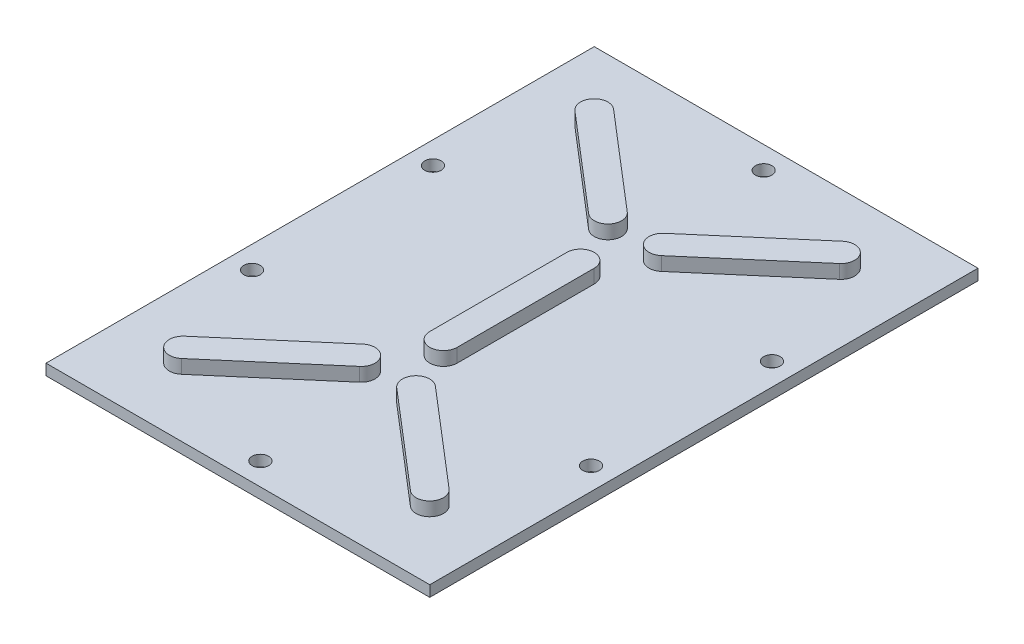
ISO-10303-21;
HEADER;
FILE_DESCRIPTION(('STEP AP214'),'2;1');
FILE_NAME('part.step','',(''),(''),'','','');
FILE_SCHEMA(('AUTOMOTIVE_DESIGN { 1 0 10303 214 1 1 1 1 }'));
ENDSEC;
DATA;
#1=APPLICATION_CONTEXT('core data for automotive mechanical design processes');
#2=APPLICATION_PROTOCOL_DEFINITION('international standard','automotive_design',2000,#1);
#3=PRODUCT_CONTEXT('',#1,'mechanical');
#4=PRODUCT('Part','Part','',(#3));
#5=PRODUCT_RELATED_PRODUCT_CATEGORY('part','',(#4));
#6=PRODUCT_DEFINITION_FORMATION('','',#4);
#7=PRODUCT_DEFINITION_CONTEXT('part definition',#1,'design');
#8=PRODUCT_DEFINITION('design','',#6,#7);
#9=PRODUCT_DEFINITION_SHAPE('','',#8);
#10=(LENGTH_UNIT() NAMED_UNIT(*) SI_UNIT(.MILLI.,.METRE.));
#11=(NAMED_UNIT(*) PLANE_ANGLE_UNIT() SI_UNIT($,.RADIAN.));
#12=(NAMED_UNIT(*) SI_UNIT($,.STERADIAN.) SOLID_ANGLE_UNIT());
#13=UNCERTAINTY_MEASURE_WITH_UNIT(LENGTH_MEASURE(1.E-05),#10,'distance_accuracy_value','');
#14=(GEOMETRIC_REPRESENTATION_CONTEXT(3) GLOBAL_UNCERTAINTY_ASSIGNED_CONTEXT((#13)) GLOBAL_UNIT_ASSIGNED_CONTEXT((#10,
#11,#12)) REPRESENTATION_CONTEXT('',''));
#15=CARTESIAN_POINT('',(0.,0.,0.));
#16=DIRECTION('',(0.,0.,1.));
#17=DIRECTION('',(1.,0.,0.));
#18=AXIS2_PLACEMENT_3D('',#15,#16,#17);
#19=CARTESIAN_POINT('',(0.,0.,0.));
#20=DIRECTION('',(0.,-1.,0.));
#21=DIRECTION('',(0.,0.,-1.));
#22=AXIS2_PLACEMENT_3D('',#19,#20,#21);
#23=PLANE('',#22);
#24=CARTESIAN_POINT('',(70.,0.,-191.8));
#25=DIRECTION('',(0.,1.,0.));
#26=DIRECTION('',(0.,0.,1.));
#27=AXIS2_PLACEMENT_3D('',#24,#25,#26);
#28=CIRCLE('',#27,3.00000000000001);
#29=CARTESIAN_POINT('',(70.,0.,-188.8));
#30=VERTEX_POINT('',#29);
#31=EDGE_CURVE('E389',#30,#30,#28,.T.);
#32=ORIENTED_EDGE('',*,*,#31,.F.);
#33=EDGE_LOOP('',(#32));
#34=FACE_BOUND('',#33,.T.);
#35=CARTESIAN_POINT('',(131.833925446024,0.,-133.));
#36=DIRECTION('',(0.,1.,0.));
#37=DIRECTION('',(0.,0.,-1.));
#38=AXIS2_PLACEMENT_3D('',#35,#36,#37);
#39=CIRCLE('',#38,3.00000000000002);
#40=CARTESIAN_POINT('',(131.833925446024,0.,-136.));
#41=VERTEX_POINT('',#40);
#42=EDGE_CURVE('E430',#41,#41,#39,.T.);
#43=ORIENTED_EDGE('',*,*,#42,.F.);
#44=EDGE_LOOP('',(#43));
#45=FACE_BOUND('',#44,.T.);
#46=CARTESIAN_POINT('',(8.16607455397644,0.,-133.));
#47=DIRECTION('',(0.,1.,0.));
#48=DIRECTION('',(0.,0.,1.));
#49=AXIS2_PLACEMENT_3D('',#46,#47,#48);
#50=CIRCLE('',#49,3.);
#51=CARTESIAN_POINT('',(8.16607455397644,0.,-130.));
#52=VERTEX_POINT('',#51);
#53=EDGE_CURVE('E423',#52,#52,#50,.T.);
#54=ORIENTED_EDGE('',*,*,#53,.F.);
#55=EDGE_LOOP('',(#54));
#56=FACE_BOUND('',#55,.T.);
#57=CARTESIAN_POINT('',(70.,0.,-8.19999999999999));
#58=DIRECTION('',(0.,1.,0.));
#59=DIRECTION('',(0.,0.,-1.));
#60=AXIS2_PLACEMENT_3D('',#57,#58,#59);
#61=CIRCLE('',#60,3.00000000000001);
#62=CARTESIAN_POINT('',(70.,0.,-11.2));
#63=VERTEX_POINT('',#62);
#64=EDGE_CURVE('E420',#63,#63,#61,.T.);
#65=ORIENTED_EDGE('',*,*,#64,.F.);
#66=EDGE_LOOP('',(#65));
#67=FACE_BOUND('',#66,.T.);
#68=CARTESIAN_POINT('',(8.16607455397644,0.,-67.));
#69=DIRECTION('',(0.,1.,0.));
#70=DIRECTION('',(0.,0.,-1.));
#71=AXIS2_PLACEMENT_3D('',#68,#69,#70);
#72=CIRCLE('',#71,3.);
#73=CARTESIAN_POINT('',(8.16607455397644,0.,-70.));
#74=VERTEX_POINT('',#73);
#75=EDGE_CURVE('E424',#74,#74,#72,.T.);
#76=ORIENTED_EDGE('',*,*,#75,.F.);
#77=EDGE_LOOP('',(#76));
#78=FACE_BOUND('',#77,.T.);
#79=CARTESIAN_POINT('',(131.833925446024,0.,-67.));
#80=DIRECTION('',(0.,1.,0.));
#81=DIRECTION('',(0.,0.,1.));
#82=AXIS2_PLACEMENT_3D('',#79,#80,#81);
#83=CIRCLE('',#82,2.99999999999999);
#84=CARTESIAN_POINT('',(131.833925446024,0.,-64.));
#85=VERTEX_POINT('',#84);
#86=EDGE_CURVE('E427',#85,#85,#83,.T.);
#87=ORIENTED_EDGE('',*,*,#86,.F.);
#88=EDGE_LOOP('',(#87));
#89=FACE_BOUND('',#88,.T.);
#90=CARTESIAN_POINT('',(60.,0.,-145.));
#91=DIRECTION('',(0.,1.,0.));
#92=DIRECTION('',(0.,0.,1.));
#93=AXIS2_PLACEMENT_3D('',#90,#91,#92);
#94=CIRCLE('',#93,5.00000000000001);
#95=CARTESIAN_POINT('',(56.7460431327202,0.,-141.203716988174));
#96=VERTEX_POINT('',#95);
#97=CARTESIAN_POINT('',(63.2539568672798,0.,-148.796283011826));
#98=VERTEX_POINT('',#97);
#99=EDGE_CURVE('E219',#96,#98,#94,.T.);
#100=ORIENTED_EDGE('',*,*,#99,.F.);
#101=DIRECTION('',(0.759256602365297,0.,0.650791373455968));
#102=VECTOR('',#101,1.);
#103=CARTESIAN_POINT('',(56.7460431327202,0.,-141.203716988174));
#104=LINE('',#103,#102);
#105=CARTESIAN_POINT('',(21.7460431327201,0.,-171.203716988174));
#106=VERTEX_POINT('',#105);
#107=EDGE_CURVE('E232',#106,#96,#104,.T.);
#108=ORIENTED_EDGE('',*,*,#107,.F.);
#109=CARTESIAN_POINT('',(25.,0.,-175.));
#110=DIRECTION('',(0.,1.,0.));
#111=DIRECTION('',(0.,0.,1.));
#112=AXIS2_PLACEMENT_3D('',#109,#110,#111);
#113=CIRCLE('',#112,5.00000000000002);
#114=CARTESIAN_POINT('',(28.2539568672799,0.,-178.796283011827));
#115=VERTEX_POINT('',#114);
#116=EDGE_CURVE('E241',#115,#106,#113,.T.);
#117=ORIENTED_EDGE('',*,*,#116,.F.);
#118=DIRECTION('',(-0.759256602365296,0.,-0.650791373455969));
#119=VECTOR('',#118,1.);
#120=CARTESIAN_POINT('',(63.2539568672798,0.,-148.796283011827));
#121=LINE('',#120,#119);
#122=EDGE_CURVE('E222',#98,#115,#121,.T.);
#123=ORIENTED_EDGE('',*,*,#122,.F.);
#124=EDGE_LOOP('',(#100,#108,#117,#123));
#125=FACE_BOUND('',#124,.T.);
#126=CARTESIAN_POINT('',(70.,0.,-75.));
#127=DIRECTION('',(0.,1.,0.));
#128=DIRECTION('',(0.,0.,1.));
#129=AXIS2_PLACEMENT_3D('',#126,#127,#128);
#130=CIRCLE('',#129,5.00000000000003);
#131=CARTESIAN_POINT('',(65.,0.,-75.));
#132=VERTEX_POINT('',#131);
#133=CARTESIAN_POINT('',(75.,0.,-75.));
#134=VERTEX_POINT('',#133);
#135=EDGE_CURVE('E290',#132,#134,#130,.T.);
#136=ORIENTED_EDGE('',*,*,#135,.F.);
#137=DIRECTION('',(0.,0.,1.));
#138=VECTOR('',#137,1.);
#139=CARTESIAN_POINT('',(65.,0.,-75.));
#140=LINE('',#139,#138);
#141=CARTESIAN_POINT('',(65.,0.,-125.));
#142=VERTEX_POINT('',#141);
#143=EDGE_CURVE('E295',#142,#132,#140,.T.);
#144=ORIENTED_EDGE('',*,*,#143,.F.);
#145=CARTESIAN_POINT('',(70.,0.,-125.));
#146=DIRECTION('',(0.,1.,0.));
#147=DIRECTION('',(0.,0.,1.));
#148=AXIS2_PLACEMENT_3D('',#145,#146,#147);
#149=CIRCLE('',#148,5.00000000000003);
#150=CARTESIAN_POINT('',(75.,0.,-125.));
#151=VERTEX_POINT('',#150);
#152=EDGE_CURVE('E307',#151,#142,#149,.T.);
#153=ORIENTED_EDGE('',*,*,#152,.F.);
#154=DIRECTION('',(0.,0.,-1.));
#155=VECTOR('',#154,1.);
#156=CARTESIAN_POINT('',(75.,0.,-75.));
#157=LINE('',#156,#155);
#158=EDGE_CURVE('E304',#134,#151,#157,.T.);
#159=ORIENTED_EDGE('',*,*,#158,.F.);
#160=EDGE_LOOP('',(#136,#144,#153,#159));
#161=FACE_BOUND('',#160,.T.);
#162=DIRECTION('',(0.,0.,1.));
#163=VECTOR('',#162,1.);
#164=CARTESIAN_POINT('',(0.,0.,0.));
#165=LINE('',#164,#163);
#166=CARTESIAN_POINT('',(0.,0.,-200.));
#167=VERTEX_POINT('',#166);
#168=CARTESIAN_POINT('',(0.,0.,0.));
#169=VERTEX_POINT('',#168);
#170=EDGE_CURVE('E356',#167,#169,#165,.T.);
#171=ORIENTED_EDGE('',*,*,#170,.T.);
#172=DIRECTION('',(1.,0.,0.));
#173=VECTOR('',#172,1.);
#174=CARTESIAN_POINT('',(0.,0.,0.));
#175=LINE('',#174,#173);
#176=CARTESIAN_POINT('',(140.,0.,0.));
#177=VERTEX_POINT('',#176);
#178=EDGE_CURVE('E373',#169,#177,#175,.T.);
#179=ORIENTED_EDGE('',*,*,#178,.T.);
#180=DIRECTION('',(0.,0.,-1.));
#181=VECTOR('',#180,1.);
#182=CARTESIAN_POINT('',(140.,0.,0.));
#183=LINE('',#182,#181);
#184=CARTESIAN_POINT('',(140.,0.,-200.));
#185=VERTEX_POINT('',#184);
#186=EDGE_CURVE('E376',#177,#185,#183,.T.);
#187=ORIENTED_EDGE('',*,*,#186,.T.);
#188=DIRECTION('',(-1.,0.,0.));
#189=VECTOR('',#188,1.);
#190=CARTESIAN_POINT('',(0.,0.,-200.));
#191=LINE('',#190,#189);
#192=EDGE_CURVE('E361',#185,#167,#191,.T.);
#193=ORIENTED_EDGE('',*,*,#192,.T.);
#194=EDGE_LOOP('',(#171,#179,#187,#193));
#195=FACE_BOUND('',#194,.T.);
#196=CARTESIAN_POINT('',(80.,0.,-55.));
#197=DIRECTION('',(0.,1.,0.));
#198=DIRECTION('',(0.,0.,1.));
#199=AXIS2_PLACEMENT_3D('',#196,#197,#198);
#200=CIRCLE('',#199,5.);
#201=CARTESIAN_POINT('',(83.2539568672799,0.,-58.7962830118265));
#202=VERTEX_POINT('',#201);
#203=CARTESIAN_POINT('',(76.7460431327202,0.,-51.2037169881735));
#204=VERTEX_POINT('',#203);
#205=EDGE_CURVE('E323',#202,#204,#200,.T.);
#206=ORIENTED_EDGE('',*,*,#205,.F.);
#207=DIRECTION('',(-0.759256602365297,0.,-0.650791373455968));
#208=VECTOR('',#207,1.);
#209=CARTESIAN_POINT('',(83.2539568672799,0.,-58.7962830118265));
#210=LINE('',#209,#208);
#211=CARTESIAN_POINT('',(118.25395686728,0.,-28.7962830118265));
#212=VERTEX_POINT('',#211);
#213=EDGE_CURVE('E328',#212,#202,#210,.T.);
#214=ORIENTED_EDGE('',*,*,#213,.F.);
#215=CARTESIAN_POINT('',(115.,0.,-25.));
#216=DIRECTION('',(0.,1.,0.));
#217=DIRECTION('',(0.,0.,1.));
#218=AXIS2_PLACEMENT_3D('',#215,#216,#217);
#219=CIRCLE('',#218,5.00000000000002);
#220=CARTESIAN_POINT('',(111.74604313272,0.,-21.2037169881735));
#221=VERTEX_POINT('',#220);
#222=EDGE_CURVE('E340',#221,#212,#219,.T.);
#223=ORIENTED_EDGE('',*,*,#222,.F.);
#224=DIRECTION('',(0.759256602365296,0.,0.650791373455969));
#225=VECTOR('',#224,1.);
#226=CARTESIAN_POINT('',(76.7460431327202,0.,-51.2037169881735));
#227=LINE('',#226,#225);
#228=EDGE_CURVE('E337',#204,#221,#227,.T.);
#229=ORIENTED_EDGE('',*,*,#228,.F.);
#230=EDGE_LOOP('',(#206,#214,#223,#229));
#231=FACE_BOUND('',#230,.T.);
#232=CARTESIAN_POINT('',(60.,0.,-55.));
#233=DIRECTION('',(0.,1.,0.));
#234=DIRECTION('',(0.,0.,-1.));
#235=AXIS2_PLACEMENT_3D('',#232,#233,#234);
#236=CIRCLE('',#235,5.);
#237=CARTESIAN_POINT('',(63.2539568672798,0.,-51.2037169881735));
#238=VERTEX_POINT('',#237);
#239=CARTESIAN_POINT('',(56.7460431327202,0.,-58.7962830118265));
#240=VERTEX_POINT('',#239);
#241=EDGE_CURVE('E257',#238,#240,#236,.T.);
#242=ORIENTED_EDGE('',*,*,#241,.F.);
#243=DIRECTION('',(0.759256602365296,0.,-0.650791373455969));
#244=VECTOR('',#243,1.);
#245=CARTESIAN_POINT('',(63.2539568672798,0.,-51.2037169881735));
#246=LINE('',#245,#244);
#247=CARTESIAN_POINT('',(28.2539568672799,0.,-21.2037169881735));
#248=VERTEX_POINT('',#247);
#249=EDGE_CURVE('E262',#248,#238,#246,.T.);
#250=ORIENTED_EDGE('',*,*,#249,.F.);
#251=CARTESIAN_POINT('',(25.,0.,-25.));
#252=DIRECTION('',(0.,1.,0.));
#253=DIRECTION('',(0.,0.,-1.));
#254=AXIS2_PLACEMENT_3D('',#251,#252,#253);
#255=CIRCLE('',#254,5.00000000000002);
#256=CARTESIAN_POINT('',(21.7460431327201,0.,-28.7962830118265));
#257=VERTEX_POINT('',#256);
#258=EDGE_CURVE('E274',#257,#248,#255,.T.);
#259=ORIENTED_EDGE('',*,*,#258,.F.);
#260=DIRECTION('',(-0.759256602365297,0.,0.650791373455968));
#261=VECTOR('',#260,1.);
#262=CARTESIAN_POINT('',(56.7460431327202,0.,-58.7962830118265));
#263=LINE('',#262,#261);
#264=EDGE_CURVE('E271',#240,#257,#263,.T.);
#265=ORIENTED_EDGE('',*,*,#264,.F.);
#266=EDGE_LOOP('',(#242,#250,#259,#265));
#267=FACE_BOUND('',#266,.T.);
#268=CARTESIAN_POINT('',(80.,0.,-145.));
#269=DIRECTION('',(0.,1.,0.));
#270=DIRECTION('',(0.,0.,-1.));
#271=AXIS2_PLACEMENT_3D('',#268,#269,#270);
#272=CIRCLE('',#271,5.00000000000001);
#273=CARTESIAN_POINT('',(76.7460431327202,0.,-148.796283011827));
#274=VERTEX_POINT('',#273);
#275=CARTESIAN_POINT('',(83.2539568672799,0.,-141.203716988174));
#276=VERTEX_POINT('',#275);
#277=EDGE_CURVE('E218',#274,#276,#272,.T.);
#278=ORIENTED_EDGE('',*,*,#277,.F.);
#279=DIRECTION('',(-0.759256602365296,0.,0.650791373455969));
#280=VECTOR('',#279,1.);
#281=CARTESIAN_POINT('',(76.7460431327202,0.,-148.796283011827));
#282=LINE('',#281,#280);
#283=CARTESIAN_POINT('',(111.74604313272,0.,-178.796283011827));
#284=VERTEX_POINT('',#283);
#285=EDGE_CURVE('E215',#284,#274,#282,.T.);
#286=ORIENTED_EDGE('',*,*,#285,.F.);
#287=CARTESIAN_POINT('',(115.,0.,-175.));
#288=DIRECTION('',(0.,1.,0.));
#289=DIRECTION('',(0.,0.,-1.));
#290=AXIS2_PLACEMENT_3D('',#287,#288,#289);
#291=CIRCLE('',#290,5.00000000000002);
#292=CARTESIAN_POINT('',(118.25395686728,0.,-171.203716988174));
#293=VERTEX_POINT('',#292);
#294=EDGE_CURVE('E58',#293,#284,#291,.T.);
#295=ORIENTED_EDGE('',*,*,#294,.F.);
#296=DIRECTION('',(0.759256602365297,0.,-0.650791373455968));
#297=VECTOR('',#296,1.);
#298=CARTESIAN_POINT('',(83.2539568672799,0.,-141.203716988174));
#299=LINE('',#298,#297);
#300=EDGE_CURVE('E53',#276,#293,#299,.T.);
#301=ORIENTED_EDGE('',*,*,#300,.F.);
#302=EDGE_LOOP('',(#278,#286,#295,#301));
#303=FACE_BOUND('',#302,.T.);
#304=ADVANCED_FACE('F36',(#34,#45,#56,#67,#78,#89,#125,#161,#195,#231,#267,#303),#23,.F.);
#305=CARTESIAN_POINT('',(0.,-4.,0.));
#306=DIRECTION('',(-1.,0.,0.));
#307=DIRECTION('',(0.,0.,1.));
#308=AXIS2_PLACEMENT_3D('',#305,#306,#307);
#309=PLANE('',#308);
#310=ORIENTED_EDGE('',*,*,#170,.F.);
#311=DIRECTION('',(0.,1.,0.));
#312=VECTOR('',#311,1.);
#313=CARTESIAN_POINT('',(0.,-4.,-200.));
#314=LINE('',#313,#312);
#315=CARTESIAN_POINT('',(0.,-4.,-200.));
#316=VERTEX_POINT('',#315);
#317=EDGE_CURVE('E11',#316,#167,#314,.T.);
#318=ORIENTED_EDGE('',*,*,#317,.F.);
#319=DIRECTION('',(0.,0.,1.));
#320=VECTOR('',#319,1.);
#321=CARTESIAN_POINT('',(0.,-4.,0.));
#322=LINE('',#321,#320);
#323=CARTESIAN_POINT('',(0.,-4.,0.));
#324=VERTEX_POINT('',#323);
#325=EDGE_CURVE('E357',#316,#324,#322,.T.);
#326=ORIENTED_EDGE('',*,*,#325,.T.);
#327=DIRECTION('',(0.,1.,0.));
#328=VECTOR('',#327,1.);
#329=CARTESIAN_POINT('',(0.,-4.,0.));
#330=LINE('',#329,#328);
#331=EDGE_CURVE('E370',#324,#169,#330,.T.);
#332=ORIENTED_EDGE('',*,*,#331,.T.);
#333=EDGE_LOOP('',(#310,#318,#326,#332));
#334=FACE_BOUND('',#333,.T.);
#335=ADVANCED_FACE('F38',(#334),#309,.T.);
#336=CARTESIAN_POINT('',(0.,-4.,-200.));
#337=DIRECTION('',(0.,0.,-1.));
#338=DIRECTION('',(-1.,0.,0.));
#339=AXIS2_PLACEMENT_3D('',#336,#337,#338);
#340=PLANE('',#339);
#341=ORIENTED_EDGE('',*,*,#192,.F.);
#342=DIRECTION('',(0.,1.,0.));
#343=VECTOR('',#342,1.);
#344=CARTESIAN_POINT('',(140.,-4.,-200.));
#345=LINE('',#344,#343);
#346=CARTESIAN_POINT('',(140.,-4.,-200.));
#347=VERTEX_POINT('',#346);
#348=EDGE_CURVE('E45',#347,#185,#345,.T.);
#349=ORIENTED_EDGE('',*,*,#348,.F.);
#350=DIRECTION('',(-1.,0.,0.));
#351=VECTOR('',#350,1.);
#352=CARTESIAN_POINT('',(0.,-4.,-200.));
#353=LINE('',#352,#351);
#354=EDGE_CURVE('E367',#347,#316,#353,.T.);
#355=ORIENTED_EDGE('',*,*,#354,.T.);
#356=ORIENTED_EDGE('',*,*,#317,.T.);
#357=EDGE_LOOP('',(#341,#349,#355,#356));
#358=FACE_BOUND('',#357,.T.);
#359=ADVANCED_FACE('F530',(#358),#340,.T.);
#360=CARTESIAN_POINT('',(140.,-4.,0.));
#361=DIRECTION('',(1.,0.,0.));
#362=DIRECTION('',(0.,0.,-1.));
#363=AXIS2_PLACEMENT_3D('',#360,#361,#362);
#364=PLANE('',#363);
#365=ORIENTED_EDGE('',*,*,#186,.F.);
#366=DIRECTION('',(0.,1.,0.));
#367=VECTOR('',#366,1.);
#368=CARTESIAN_POINT('',(140.,-4.,0.));
#369=LINE('',#368,#367);
#370=CARTESIAN_POINT('',(140.,-4.,0.));
#371=VERTEX_POINT('',#370);
#372=EDGE_CURVE('E382',#371,#177,#369,.T.);
#373=ORIENTED_EDGE('',*,*,#372,.F.);
#374=DIRECTION('',(0.,0.,-1.));
#375=VECTOR('',#374,1.);
#376=CARTESIAN_POINT('',(140.,-4.,0.));
#377=LINE('',#376,#375);
#378=EDGE_CURVE('E364',#371,#347,#377,.T.);
#379=ORIENTED_EDGE('',*,*,#378,.T.);
#380=ORIENTED_EDGE('',*,*,#348,.T.);
#381=EDGE_LOOP('',(#365,#373,#379,#380));
#382=FACE_BOUND('',#381,.T.);
#383=ADVANCED_FACE('F533',(#382),#364,.T.);
#384=CARTESIAN_POINT('',(0.,-4.,0.));
#385=DIRECTION('',(0.,0.,1.));
#386=DIRECTION('',(1.,0.,0.));
#387=AXIS2_PLACEMENT_3D('',#384,#385,#386);
#388=PLANE('',#387);
#389=ORIENTED_EDGE('',*,*,#178,.F.);
#390=ORIENTED_EDGE('',*,*,#331,.F.);
#391=DIRECTION('',(1.,0.,0.));
#392=VECTOR('',#391,1.);
#393=CARTESIAN_POINT('',(0.,-4.,0.));
#394=LINE('',#393,#392);
#395=EDGE_CURVE('E360',#324,#371,#394,.T.);
#396=ORIENTED_EDGE('',*,*,#395,.T.);
#397=ORIENTED_EDGE('',*,*,#372,.T.);
#398=EDGE_LOOP('',(#389,#390,#396,#397));
#399=FACE_BOUND('',#398,.T.);
#400=ADVANCED_FACE('F527',(#399),#388,.T.);
#401=CARTESIAN_POINT('',(0.,-4.,0.));
#402=DIRECTION('',(0.,-1.,0.));
#403=DIRECTION('',(0.,0.,-1.));
#404=AXIS2_PLACEMENT_3D('',#401,#402,#403);
#405=PLANE('',#404);
#406=CARTESIAN_POINT('',(70.,-4.,-191.8));
#407=DIRECTION('',(0.,-1.,0.));
#408=DIRECTION('',(0.,0.,-1.));
#409=AXIS2_PLACEMENT_3D('',#406,#407,#408);
#410=CIRCLE('',#409,3.00000000000001);
#411=CARTESIAN_POINT('',(70.,-4.,-194.8));
#412=VERTEX_POINT('',#411);
#413=EDGE_CURVE('E40',#412,#412,#410,.T.);
#414=ORIENTED_EDGE('',*,*,#413,.F.);
#415=EDGE_LOOP('',(#414));
#416=FACE_BOUND('',#415,.T.);
#417=CARTESIAN_POINT('',(131.833925446024,-4.,-133.));
#418=DIRECTION('',(0.,-1.,0.));
#419=DIRECTION('',(0.,0.,-1.));
#420=AXIS2_PLACEMENT_3D('',#417,#418,#419);
#421=CIRCLE('',#420,3.00000000000002);
#422=CARTESIAN_POINT('',(131.833925446024,-4.,-136.));
#423=VERTEX_POINT('',#422);
#424=EDGE_CURVE('E397',#423,#423,#421,.T.);
#425=ORIENTED_EDGE('',*,*,#424,.F.);
#426=EDGE_LOOP('',(#425));
#427=FACE_BOUND('',#426,.T.);
#428=CARTESIAN_POINT('',(8.16607455397644,-4.,-133.));
#429=DIRECTION('',(0.,-1.,0.));
#430=DIRECTION('',(0.,0.,-1.));
#431=AXIS2_PLACEMENT_3D('',#428,#429,#430);
#432=CIRCLE('',#431,3.);
#433=CARTESIAN_POINT('',(8.16607455397644,-4.,-136.));
#434=VERTEX_POINT('',#433);
#435=EDGE_CURVE('E395',#434,#434,#432,.T.);
#436=ORIENTED_EDGE('',*,*,#435,.F.);
#437=EDGE_LOOP('',(#436));
#438=FACE_BOUND('',#437,.T.);
#439=CARTESIAN_POINT('',(70.,-4.,-8.19999999999999));
#440=DIRECTION('',(0.,-1.,0.));
#441=DIRECTION('',(0.,0.,-1.));
#442=AXIS2_PLACEMENT_3D('',#439,#440,#441);
#443=CIRCLE('',#442,3.00000000000001);
#444=CARTESIAN_POINT('',(70.,-4.,-11.2));
#445=VERTEX_POINT('',#444);
#446=EDGE_CURVE('E392',#445,#445,#443,.T.);
#447=ORIENTED_EDGE('',*,*,#446,.F.);
#448=EDGE_LOOP('',(#447));
#449=FACE_BOUND('',#448,.T.);
#450=CARTESIAN_POINT('',(8.16607455397644,-4.,-67.));
#451=DIRECTION('',(0.,-1.,0.));
#452=DIRECTION('',(0.,0.,-1.));
#453=AXIS2_PLACEMENT_3D('',#450,#451,#452);
#454=CIRCLE('',#453,3.);
#455=CARTESIAN_POINT('',(8.16607455397644,-4.,-70.));
#456=VERTEX_POINT('',#455);
#457=EDGE_CURVE('E388',#456,#456,#454,.T.);
#458=ORIENTED_EDGE('',*,*,#457,.F.);
#459=EDGE_LOOP('',(#458));
#460=FACE_BOUND('',#459,.T.);
#461=CARTESIAN_POINT('',(131.833925446024,-4.,-67.));
#462=DIRECTION('',(0.,-1.,0.));
#463=DIRECTION('',(0.,0.,-1.));
#464=AXIS2_PLACEMENT_3D('',#461,#462,#463);
#465=CIRCLE('',#464,2.99999999999999);
#466=CARTESIAN_POINT('',(131.833925446024,-4.,-70.));
#467=VERTEX_POINT('',#466);
#468=EDGE_CURVE('E385',#467,#467,#465,.T.);
#469=ORIENTED_EDGE('',*,*,#468,.F.);
#470=EDGE_LOOP('',(#469));
#471=FACE_BOUND('',#470,.T.);
#472=ORIENTED_EDGE('',*,*,#325,.F.);
#473=ORIENTED_EDGE('',*,*,#354,.F.);
#474=ORIENTED_EDGE('',*,*,#378,.F.);
#475=ORIENTED_EDGE('',*,*,#395,.F.);
#476=EDGE_LOOP('',(#472,#473,#474,#475));
#477=FACE_BOUND('',#476,.T.);
#478=ADVANCED_FACE('F524',(#416,#427,#438,#449,#460,#471,#477),#405,.T.);
#479=CARTESIAN_POINT('',(80.,5.,-55.));
#480=DIRECTION('',(0.,-1.,0.));
#481=DIRECTION('',(0.,0.,-1.));
#482=AXIS2_PLACEMENT_3D('',#479,#480,#481);
#483=CYLINDRICAL_SURFACE('',#482,5.);
#484=ORIENTED_EDGE('',*,*,#205,.T.);
#485=DIRECTION('',(0.,-1.,0.));
#486=VECTOR('',#485,1.);
#487=CARTESIAN_POINT('',(76.7460431327202,5.,-51.2037169881735));
#488=LINE('',#487,#486);
#489=CARTESIAN_POINT('',(76.7460431327202,5.,-51.2037169881735));
#490=VERTEX_POINT('',#489);
#491=EDGE_CURVE('E353',#490,#204,#488,.T.);
#492=ORIENTED_EDGE('',*,*,#491,.F.);
#493=CARTESIAN_POINT('',(80.,5.,-55.));
#494=DIRECTION('',(0.,1.,0.));
#495=DIRECTION('',(0.,0.,1.));
#496=AXIS2_PLACEMENT_3D('',#493,#494,#495);
#497=CIRCLE('',#496,5.);
#498=CARTESIAN_POINT('',(83.2539568672799,5.,-58.7962830118265));
#499=VERTEX_POINT('',#498);
#500=EDGE_CURVE('E324',#499,#490,#497,.T.);
#501=ORIENTED_EDGE('',*,*,#500,.F.);
#502=DIRECTION('',(0.,-1.,0.));
#503=VECTOR('',#502,1.);
#504=CARTESIAN_POINT('',(83.2539568672799,5.,-58.7962830118265));
#505=LINE('',#504,#503);
#506=EDGE_CURVE('E334',#499,#202,#505,.T.);
#507=ORIENTED_EDGE('',*,*,#506,.T.);
#508=EDGE_LOOP('',(#484,#492,#501,#507));
#509=FACE_BOUND('',#508,.T.);
#510=ADVANCED_FACE('F520',(#509),#483,.T.);
#511=CARTESIAN_POINT('',(76.7460431327202,5.,-51.2037169881735));
#512=DIRECTION('',(0.650791373455969,0.,-0.759256602365296));
#513=DIRECTION('',(-0.759256602365296,0.,-0.650791373455969));
#514=AXIS2_PLACEMENT_3D('',#511,#512,#513);
#515=PLANE('',#514);
#516=ORIENTED_EDGE('',*,*,#228,.T.);
#517=DIRECTION('',(0.,-1.,0.));
#518=VECTOR('',#517,1.);
#519=CARTESIAN_POINT('',(111.74604313272,5.,-21.2037169881735));
#520=LINE('',#519,#518);
#521=CARTESIAN_POINT('',(111.74604313272,5.,-21.2037169881735));
#522=VERTEX_POINT('',#521);
#523=EDGE_CURVE('E350',#522,#221,#520,.T.);
#524=ORIENTED_EDGE('',*,*,#523,.F.);
#525=DIRECTION('',(0.759256602365296,0.,0.650791373455969));
#526=VECTOR('',#525,1.);
#527=CARTESIAN_POINT('',(76.7460431327202,5.,-51.2037169881735));
#528=LINE('',#527,#526);
#529=EDGE_CURVE('E327',#490,#522,#528,.T.);
#530=ORIENTED_EDGE('',*,*,#529,.F.);
#531=ORIENTED_EDGE('',*,*,#491,.T.);
#532=EDGE_LOOP('',(#516,#524,#530,#531));
#533=FACE_BOUND('',#532,.T.);
#534=ADVANCED_FACE('F516',(#533),#515,.F.);
#535=CARTESIAN_POINT('',(115.,5.,-25.));
#536=DIRECTION('',(0.,-1.,0.));
#537=DIRECTION('',(0.,0.,-1.));
#538=AXIS2_PLACEMENT_3D('',#535,#536,#537);
#539=CYLINDRICAL_SURFACE('',#538,5.00000000000002);
#540=ORIENTED_EDGE('',*,*,#222,.T.);
#541=DIRECTION('',(0.,-1.,0.));
#542=VECTOR('',#541,1.);
#543=CARTESIAN_POINT('',(118.25395686728,5.,-28.7962830118265));
#544=LINE('',#543,#542);
#545=CARTESIAN_POINT('',(118.25395686728,5.,-28.7962830118265));
#546=VERTEX_POINT('',#545);
#547=EDGE_CURVE('E347',#546,#212,#544,.T.);
#548=ORIENTED_EDGE('',*,*,#547,.F.);
#549=CARTESIAN_POINT('',(115.,5.,-25.));
#550=DIRECTION('',(0.,1.,0.));
#551=DIRECTION('',(0.,0.,1.));
#552=AXIS2_PLACEMENT_3D('',#549,#550,#551);
#553=CIRCLE('',#552,5.00000000000002);
#554=EDGE_CURVE('E330',#522,#546,#553,.T.);
#555=ORIENTED_EDGE('',*,*,#554,.F.);
#556=ORIENTED_EDGE('',*,*,#523,.T.);
#557=EDGE_LOOP('',(#540,#548,#555,#556));
#558=FACE_BOUND('',#557,.T.);
#559=ADVANCED_FACE('F512',(#558),#539,.T.);
#560=CARTESIAN_POINT('',(83.2539568672799,5.,-58.7962830118265));
#561=DIRECTION('',(-0.650791373455968,0.,0.759256602365297));
#562=DIRECTION('',(0.759256602365297,0.,0.650791373455968));
#563=AXIS2_PLACEMENT_3D('',#560,#561,#562);
#564=PLANE('',#563);
#565=ORIENTED_EDGE('',*,*,#213,.T.);
#566=ORIENTED_EDGE('',*,*,#506,.F.);
#567=DIRECTION('',(-0.759256602365297,0.,-0.650791373455968));
#568=VECTOR('',#567,1.);
#569=CARTESIAN_POINT('',(83.2539568672799,5.,-58.7962830118265));
#570=LINE('',#569,#568);
#571=EDGE_CURVE('E332',#546,#499,#570,.T.);
#572=ORIENTED_EDGE('',*,*,#571,.F.);
#573=ORIENTED_EDGE('',*,*,#547,.T.);
#574=EDGE_LOOP('',(#565,#566,#572,#573));
#575=FACE_BOUND('',#574,.T.);
#576=ADVANCED_FACE('F508',(#575),#564,.F.);
#577=CARTESIAN_POINT('',(80.,5.,-55.));
#578=DIRECTION('',(0.,1.,0.));
#579=DIRECTION('',(0.,0.,1.));
#580=AXIS2_PLACEMENT_3D('',#577,#578,#579);
#581=PLANE('',#580);
#582=ORIENTED_EDGE('',*,*,#500,.T.);
#583=ORIENTED_EDGE('',*,*,#529,.T.);
#584=ORIENTED_EDGE('',*,*,#554,.T.);
#585=ORIENTED_EDGE('',*,*,#571,.T.);
#586=EDGE_LOOP('',(#582,#583,#584,#585));
#587=FACE_BOUND('',#586,.T.);
#588=ADVANCED_FACE('F504',(#587),#581,.T.);
#589=CARTESIAN_POINT('',(70.,5.,-75.));
#590=DIRECTION('',(0.,-1.,0.));
#591=DIRECTION('',(0.,0.,-1.));
#592=AXIS2_PLACEMENT_3D('',#589,#590,#591);
#593=CYLINDRICAL_SURFACE('',#592,5.00000000000003);
#594=ORIENTED_EDGE('',*,*,#135,.T.);
#595=DIRECTION('',(0.,-1.,0.));
#596=VECTOR('',#595,1.);
#597=CARTESIAN_POINT('',(75.,5.,-75.));
#598=LINE('',#597,#596);
#599=CARTESIAN_POINT('',(75.,5.,-75.));
#600=VERTEX_POINT('',#599);
#601=EDGE_CURVE('E320',#600,#134,#598,.T.);
#602=ORIENTED_EDGE('',*,*,#601,.F.);
#603=CARTESIAN_POINT('',(70.,5.,-75.));
#604=DIRECTION('',(0.,1.,0.));
#605=DIRECTION('',(0.,0.,1.));
#606=AXIS2_PLACEMENT_3D('',#603,#604,#605);
#607=CIRCLE('',#606,5.00000000000003);
#608=CARTESIAN_POINT('',(65.,5.,-75.));
#609=VERTEX_POINT('',#608);
#610=EDGE_CURVE('E291',#609,#600,#607,.T.);
#611=ORIENTED_EDGE('',*,*,#610,.F.);
#612=DIRECTION('',(0.,-1.,0.));
#613=VECTOR('',#612,1.);
#614=CARTESIAN_POINT('',(65.,5.,-75.));
#615=LINE('',#614,#613);
#616=EDGE_CURVE('E301',#609,#132,#615,.T.);
#617=ORIENTED_EDGE('',*,*,#616,.T.);
#618=EDGE_LOOP('',(#594,#602,#611,#617));
#619=FACE_BOUND('',#618,.T.);
#620=ADVANCED_FACE('F500',(#619),#593,.T.);
#621=CARTESIAN_POINT('',(75.,5.,-75.));
#622=DIRECTION('',(-1.,0.,0.));
#623=DIRECTION('',(0.,0.,1.));
#624=AXIS2_PLACEMENT_3D('',#621,#622,#623);
#625=PLANE('',#624);
#626=ORIENTED_EDGE('',*,*,#158,.T.);
#627=DIRECTION('',(0.,-1.,0.));
#628=VECTOR('',#627,1.);
#629=CARTESIAN_POINT('',(75.,5.,-125.));
#630=LINE('',#629,#628);
#631=CARTESIAN_POINT('',(75.,5.,-125.));
#632=VERTEX_POINT('',#631);
#633=EDGE_CURVE('E317',#632,#151,#630,.T.);
#634=ORIENTED_EDGE('',*,*,#633,.F.);
#635=DIRECTION('',(0.,0.,-1.));
#636=VECTOR('',#635,1.);
#637=CARTESIAN_POINT('',(75.,5.,-75.));
#638=LINE('',#637,#636);
#639=EDGE_CURVE('E294',#600,#632,#638,.T.);
#640=ORIENTED_EDGE('',*,*,#639,.F.);
#641=ORIENTED_EDGE('',*,*,#601,.T.);
#642=EDGE_LOOP('',(#626,#634,#640,#641));
#643=FACE_BOUND('',#642,.T.);
#644=ADVANCED_FACE('F496',(#643),#625,.F.);
#645=CARTESIAN_POINT('',(70.,5.,-125.));
#646=DIRECTION('',(0.,-1.,0.));
#647=DIRECTION('',(0.,0.,-1.));
#648=AXIS2_PLACEMENT_3D('',#645,#646,#647);
#649=CYLINDRICAL_SURFACE('',#648,5.00000000000003);
#650=ORIENTED_EDGE('',*,*,#152,.T.);
#651=DIRECTION('',(0.,-1.,0.));
#652=VECTOR('',#651,1.);
#653=CARTESIAN_POINT('',(65.,5.,-125.));
#654=LINE('',#653,#652);
#655=CARTESIAN_POINT('',(65.,5.,-125.));
#656=VERTEX_POINT('',#655);
#657=EDGE_CURVE('E314',#656,#142,#654,.T.);
#658=ORIENTED_EDGE('',*,*,#657,.F.);
#659=CARTESIAN_POINT('',(70.,5.,-125.));
#660=DIRECTION('',(0.,1.,0.));
#661=DIRECTION('',(0.,0.,1.));
#662=AXIS2_PLACEMENT_3D('',#659,#660,#661);
#663=CIRCLE('',#662,5.00000000000003);
#664=EDGE_CURVE('E297',#632,#656,#663,.T.);
#665=ORIENTED_EDGE('',*,*,#664,.F.);
#666=ORIENTED_EDGE('',*,*,#633,.T.);
#667=EDGE_LOOP('',(#650,#658,#665,#666));
#668=FACE_BOUND('',#667,.T.);
#669=ADVANCED_FACE('F492',(#668),#649,.T.);
#670=CARTESIAN_POINT('',(65.,5.,-75.));
#671=DIRECTION('',(1.,0.,0.));
#672=DIRECTION('',(0.,0.,-1.));
#673=AXIS2_PLACEMENT_3D('',#670,#671,#672);
#674=PLANE('',#673);
#675=ORIENTED_EDGE('',*,*,#143,.T.);
#676=ORIENTED_EDGE('',*,*,#616,.F.);
#677=DIRECTION('',(0.,0.,1.));
#678=VECTOR('',#677,1.);
#679=CARTESIAN_POINT('',(65.,5.,-75.));
#680=LINE('',#679,#678);
#681=EDGE_CURVE('E299',#656,#609,#680,.T.);
#682=ORIENTED_EDGE('',*,*,#681,.F.);
#683=ORIENTED_EDGE('',*,*,#657,.T.);
#684=EDGE_LOOP('',(#675,#676,#682,#683));
#685=FACE_BOUND('',#684,.T.);
#686=ADVANCED_FACE('F488',(#685),#674,.F.);
#687=CARTESIAN_POINT('',(70.,5.,-75.));
#688=DIRECTION('',(0.,1.,0.));
#689=DIRECTION('',(0.,0.,1.));
#690=AXIS2_PLACEMENT_3D('',#687,#688,#689);
#691=PLANE('',#690);
#692=ORIENTED_EDGE('',*,*,#610,.T.);
#693=ORIENTED_EDGE('',*,*,#639,.T.);
#694=ORIENTED_EDGE('',*,*,#664,.T.);
#695=ORIENTED_EDGE('',*,*,#681,.T.);
#696=EDGE_LOOP('',(#692,#693,#694,#695));
#697=FACE_BOUND('',#696,.T.);
#698=ADVANCED_FACE('F482',(#697),#691,.T.);
#699=CARTESIAN_POINT('',(60.,5.,-55.));
#700=DIRECTION('',(0.,-1.,0.));
#701=DIRECTION('',(0.,0.,-1.));
#702=AXIS2_PLACEMENT_3D('',#699,#700,#701);
#703=CYLINDRICAL_SURFACE('',#702,5.);
#704=ORIENTED_EDGE('',*,*,#241,.T.);
#705=DIRECTION('',(0.,-1.,0.));
#706=VECTOR('',#705,1.);
#707=CARTESIAN_POINT('',(56.7460431327202,5.,-58.7962830118265));
#708=LINE('',#707,#706);
#709=CARTESIAN_POINT('',(56.7460431327202,5.,-58.7962830118265));
#710=VERTEX_POINT('',#709);
#711=EDGE_CURVE('E287',#710,#240,#708,.T.);
#712=ORIENTED_EDGE('',*,*,#711,.F.);
#713=CARTESIAN_POINT('',(60.,5.,-55.));
#714=DIRECTION('',(0.,1.,0.));
#715=DIRECTION('',(0.,0.,-1.));
#716=AXIS2_PLACEMENT_3D('',#713,#714,#715);
#717=CIRCLE('',#716,5.);
#718=CARTESIAN_POINT('',(63.2539568672798,5.,-51.2037169881735));
#719=VERTEX_POINT('',#718);
#720=EDGE_CURVE('E258',#719,#710,#717,.T.);
#721=ORIENTED_EDGE('',*,*,#720,.F.);
#722=DIRECTION('',(0.,-1.,0.));
#723=VECTOR('',#722,1.);
#724=CARTESIAN_POINT('',(63.2539568672798,5.,-51.2037169881735));
#725=LINE('',#724,#723);
#726=EDGE_CURVE('E268',#719,#238,#725,.T.);
#727=ORIENTED_EDGE('',*,*,#726,.T.);
#728=EDGE_LOOP('',(#704,#712,#721,#727));
#729=FACE_BOUND('',#728,.T.);
#730=ADVANCED_FACE('F466',(#729),#703,.T.);
#731=CARTESIAN_POINT('',(56.7460431327202,5.,-58.7962830118265));
#732=DIRECTION('',(0.650791373455968,0.,0.759256602365297));
#733=DIRECTION('',(0.759256602365297,0.,-0.650791373455968));
#734=AXIS2_PLACEMENT_3D('',#731,#732,#733);
#735=PLANE('',#734);
#736=ORIENTED_EDGE('',*,*,#264,.T.);
#737=DIRECTION('',(0.,-1.,0.));
#738=VECTOR('',#737,1.);
#739=CARTESIAN_POINT('',(21.7460431327201,5.,-28.7962830118265));
#740=LINE('',#739,#738);
#741=CARTESIAN_POINT('',(21.7460431327201,5.,-28.7962830118265));
#742=VERTEX_POINT('',#741);
#743=EDGE_CURVE('E284',#742,#257,#740,.T.);
#744=ORIENTED_EDGE('',*,*,#743,.F.);
#745=DIRECTION('',(-0.759256602365297,0.,0.650791373455968));
#746=VECTOR('',#745,1.);
#747=CARTESIAN_POINT('',(56.7460431327202,5.,-58.7962830118265));
#748=LINE('',#747,#746);
#749=EDGE_CURVE('E261',#710,#742,#748,.T.);
#750=ORIENTED_EDGE('',*,*,#749,.F.);
#751=ORIENTED_EDGE('',*,*,#711,.T.);
#752=EDGE_LOOP('',(#736,#744,#750,#751));
#753=FACE_BOUND('',#752,.T.);
#754=ADVANCED_FACE('F474',(#753),#735,.F.);
#755=CARTESIAN_POINT('',(25.,5.,-25.));
#756=DIRECTION('',(0.,-1.,0.));
#757=DIRECTION('',(0.,0.,-1.));
#758=AXIS2_PLACEMENT_3D('',#755,#756,#757);
#759=CYLINDRICAL_SURFACE('',#758,5.00000000000002);
#760=ORIENTED_EDGE('',*,*,#258,.T.);
#761=DIRECTION('',(0.,-1.,0.));
#762=VECTOR('',#761,1.);
#763=CARTESIAN_POINT('',(28.2539568672799,5.,-21.2037169881735));
#764=LINE('',#763,#762);
#765=CARTESIAN_POINT('',(28.2539568672799,5.,-21.2037169881735));
#766=VERTEX_POINT('',#765);
#767=EDGE_CURVE('E281',#766,#248,#764,.T.);
#768=ORIENTED_EDGE('',*,*,#767,.F.);
#769=CARTESIAN_POINT('',(25.,5.,-25.));
#770=DIRECTION('',(0.,1.,0.));
#771=DIRECTION('',(0.,0.,-1.));
#772=AXIS2_PLACEMENT_3D('',#769,#770,#771);
#773=CIRCLE('',#772,5.00000000000002);
#774=EDGE_CURVE('E264',#742,#766,#773,.T.);
#775=ORIENTED_EDGE('',*,*,#774,.F.);
#776=ORIENTED_EDGE('',*,*,#743,.T.);
#777=EDGE_LOOP('',(#760,#768,#775,#776));
#778=FACE_BOUND('',#777,.T.);
#779=ADVANCED_FACE('F472',(#778),#759,.T.);
#780=CARTESIAN_POINT('',(63.2539568672798,5.,-51.2037169881735));
#781=DIRECTION('',(-0.650791373455969,0.,-0.759256602365296));
#782=DIRECTION('',(-0.759256602365296,0.,0.650791373455969));
#783=AXIS2_PLACEMENT_3D('',#780,#781,#782);
#784=PLANE('',#783);
#785=ORIENTED_EDGE('',*,*,#249,.T.);
#786=ORIENTED_EDGE('',*,*,#726,.F.);
#787=DIRECTION('',(0.759256602365296,0.,-0.650791373455969));
#788=VECTOR('',#787,1.);
#789=CARTESIAN_POINT('',(63.2539568672798,5.,-51.2037169881735));
#790=LINE('',#789,#788);
#791=EDGE_CURVE('E266',#766,#719,#790,.T.);
#792=ORIENTED_EDGE('',*,*,#791,.F.);
#793=ORIENTED_EDGE('',*,*,#767,.T.);
#794=EDGE_LOOP('',(#785,#786,#792,#793));
#795=FACE_BOUND('',#794,.T.);
#796=ADVANCED_FACE('F462',(#795),#784,.F.);
#797=CARTESIAN_POINT('',(60.,5.,-55.));
#798=DIRECTION('',(0.,-1.,0.));
#799=DIRECTION('',(0.,0.,-1.));
#800=AXIS2_PLACEMENT_3D('',#797,#798,#799);
#801=PLANE('',#800);
#802=ORIENTED_EDGE('',*,*,#720,.T.);
#803=ORIENTED_EDGE('',*,*,#749,.T.);
#804=ORIENTED_EDGE('',*,*,#774,.T.);
#805=ORIENTED_EDGE('',*,*,#791,.T.);
#806=EDGE_LOOP('',(#802,#803,#804,#805));
#807=FACE_BOUND('',#806,.T.);
#808=ADVANCED_FACE('F468',(#807),#801,.F.);
#809=CARTESIAN_POINT('',(60.,5.,-145.));
#810=DIRECTION('',(0.,-1.,0.));
#811=DIRECTION('',(0.,0.,-1.));
#812=AXIS2_PLACEMENT_3D('',#809,#810,#811);
#813=CYLINDRICAL_SURFACE('',#812,5.00000000000001);
#814=ORIENTED_EDGE('',*,*,#99,.T.);
#815=DIRECTION('',(0.,-1.,0.));
#816=VECTOR('',#815,1.);
#817=CARTESIAN_POINT('',(63.2539568672798,5.,-148.796283011827));
#818=LINE('',#817,#816);
#819=CARTESIAN_POINT('',(63.2539568672798,5.,-148.796283011827));
#820=VERTEX_POINT('',#819);
#821=EDGE_CURVE('E254',#820,#98,#818,.T.);
#822=ORIENTED_EDGE('',*,*,#821,.F.);
#823=CARTESIAN_POINT('',(60.,5.,-145.));
#824=DIRECTION('',(0.,1.,0.));
#825=DIRECTION('',(0.,0.,1.));
#826=AXIS2_PLACEMENT_3D('',#823,#824,#825);
#827=CIRCLE('',#826,5.00000000000001);
#828=CARTESIAN_POINT('',(56.7460431327202,5.,-141.203716988174));
#829=VERTEX_POINT('',#828);
#830=EDGE_CURVE('E228',#829,#820,#827,.T.);
#831=ORIENTED_EDGE('',*,*,#830,.F.);
#832=DIRECTION('',(0.,-1.,0.));
#833=VECTOR('',#832,1.);
#834=CARTESIAN_POINT('',(56.7460431327202,5.,-141.203716988174));
#835=LINE('',#834,#833);
#836=EDGE_CURVE('E237',#829,#96,#835,.T.);
#837=ORIENTED_EDGE('',*,*,#836,.T.);
#838=EDGE_LOOP('',(#814,#822,#831,#837));
#839=FACE_BOUND('',#838,.T.);
#840=ADVANCED_FACE('F665',(#839),#813,.T.);
#841=CARTESIAN_POINT('',(63.2539568672798,5.,-148.796283011827));
#842=DIRECTION('',(-0.650791373455969,0.,0.759256602365296));
#843=DIRECTION('',(0.759256602365296,0.,0.650791373455969));
#844=AXIS2_PLACEMENT_3D('',#841,#842,#843);
#845=PLANE('',#844);
#846=ORIENTED_EDGE('',*,*,#122,.T.);
#847=DIRECTION('',(0.,-1.,0.));
#848=VECTOR('',#847,1.);
#849=CARTESIAN_POINT('',(28.2539568672799,5.,-178.796283011827));
#850=LINE('',#849,#848);
#851=CARTESIAN_POINT('',(28.2539568672799,5.,-178.796283011827));
#852=VERTEX_POINT('',#851);
#853=EDGE_CURVE('E251',#852,#115,#850,.T.);
#854=ORIENTED_EDGE('',*,*,#853,.F.);
#855=DIRECTION('',(-0.759256602365296,0.,-0.650791373455969));
#856=VECTOR('',#855,1.);
#857=CARTESIAN_POINT('',(63.2539568672798,5.,-148.796283011827));
#858=LINE('',#857,#856);
#859=EDGE_CURVE('E231',#820,#852,#858,.T.);
#860=ORIENTED_EDGE('',*,*,#859,.F.);
#861=ORIENTED_EDGE('',*,*,#821,.T.);
#862=EDGE_LOOP('',(#846,#854,#860,#861));
#863=FACE_BOUND('',#862,.T.);
#864=ADVANCED_FACE('F675',(#863),#845,.F.);
#865=CARTESIAN_POINT('',(25.,5.,-175.));
#866=DIRECTION('',(0.,-1.,0.));
#867=DIRECTION('',(0.,0.,-1.));
#868=AXIS2_PLACEMENT_3D('',#865,#866,#867);
#869=CYLINDRICAL_SURFACE('',#868,5.00000000000002);
#870=ORIENTED_EDGE('',*,*,#116,.T.);
#871=DIRECTION('',(0.,-1.,0.));
#872=VECTOR('',#871,1.);
#873=CARTESIAN_POINT('',(21.7460431327201,5.,-171.203716988174));
#874=LINE('',#873,#872);
#875=CARTESIAN_POINT('',(21.7460431327201,5.,-171.203716988174));
#876=VERTEX_POINT('',#875);
#877=EDGE_CURVE('E248',#876,#106,#874,.T.);
#878=ORIENTED_EDGE('',*,*,#877,.F.);
#879=CARTESIAN_POINT('',(25.,5.,-175.));
#880=DIRECTION('',(0.,1.,0.));
#881=DIRECTION('',(0.,0.,1.));
#882=AXIS2_PLACEMENT_3D('',#879,#880,#881);
#883=CIRCLE('',#882,5.00000000000002);
#884=EDGE_CURVE('E234',#852,#876,#883,.T.);
#885=ORIENTED_EDGE('',*,*,#884,.F.);
#886=ORIENTED_EDGE('',*,*,#853,.T.);
#887=EDGE_LOOP('',(#870,#878,#885,#886));
#888=FACE_BOUND('',#887,.T.);
#889=ADVANCED_FACE('F685',(#888),#869,.T.);
#890=CARTESIAN_POINT('',(56.7460431327202,5.,-141.203716988174));
#891=DIRECTION('',(0.650791373455968,0.,-0.759256602365297));
#892=DIRECTION('',(-0.759256602365297,0.,-0.650791373455968));
#893=AXIS2_PLACEMENT_3D('',#890,#891,#892);
#894=PLANE('',#893);
#895=ORIENTED_EDGE('',*,*,#107,.T.);
#896=ORIENTED_EDGE('',*,*,#836,.F.);
#897=DIRECTION('',(0.759256602365297,0.,0.650791373455968));
#898=VECTOR('',#897,1.);
#899=CARTESIAN_POINT('',(56.7460431327202,5.,-141.203716988174));
#900=LINE('',#899,#898);
#901=EDGE_CURVE('E236',#876,#829,#900,.T.);
#902=ORIENTED_EDGE('',*,*,#901,.F.);
#903=ORIENTED_EDGE('',*,*,#877,.T.);
#904=EDGE_LOOP('',(#895,#896,#902,#903));
#905=FACE_BOUND('',#904,.T.);
#906=ADVANCED_FACE('F695',(#905),#894,.F.);
#907=CARTESIAN_POINT('',(60.,5.,-145.));
#908=DIRECTION('',(0.,1.,0.));
#909=DIRECTION('',(0.,0.,1.));
#910=AXIS2_PLACEMENT_3D('',#907,#908,#909);
#911=PLANE('',#910);
#912=ORIENTED_EDGE('',*,*,#830,.T.);
#913=ORIENTED_EDGE('',*,*,#859,.T.);
#914=ORIENTED_EDGE('',*,*,#884,.T.);
#915=ORIENTED_EDGE('',*,*,#901,.T.);
#916=EDGE_LOOP('',(#912,#913,#914,#915));
#917=FACE_BOUND('',#916,.T.);
#918=ADVANCED_FACE('F705',(#917),#911,.T.);
#919=CARTESIAN_POINT('',(80.,5.,-145.));
#920=DIRECTION('',(0.,-1.,0.));
#921=DIRECTION('',(0.,0.,-1.));
#922=AXIS2_PLACEMENT_3D('',#919,#920,#921);
#923=CYLINDRICAL_SURFACE('',#922,5.00000000000001);
#924=ORIENTED_EDGE('',*,*,#277,.T.);
#925=DIRECTION('',(0.,-1.,0.));
#926=VECTOR('',#925,1.);
#927=CARTESIAN_POINT('',(83.2539568672799,5.,-141.203716988174));
#928=LINE('',#927,#926);
#929=CARTESIAN_POINT('',(83.2539568672799,5.,-141.203716988174));
#930=VERTEX_POINT('',#929);
#931=EDGE_CURVE('E199',#930,#276,#928,.T.);
#932=ORIENTED_EDGE('',*,*,#931,.F.);
#933=CARTESIAN_POINT('',(80.,5.,-145.));
#934=DIRECTION('',(0.,1.,0.));
#935=DIRECTION('',(0.,0.,-1.));
#936=AXIS2_PLACEMENT_3D('',#933,#934,#935);
#937=CIRCLE('',#936,5.00000000000001);
#938=CARTESIAN_POINT('',(76.7460431327202,5.,-148.796283011827));
#939=VERTEX_POINT('',#938);
#940=EDGE_CURVE('E206',#939,#930,#937,.T.);
#941=ORIENTED_EDGE('',*,*,#940,.F.);
#942=DIRECTION('',(0.,-1.,0.));
#943=VECTOR('',#942,1.);
#944=CARTESIAN_POINT('',(76.7460431327202,5.,-148.796283011827));
#945=LINE('',#944,#943);
#946=EDGE_CURVE('E412',#939,#274,#945,.T.);
#947=ORIENTED_EDGE('',*,*,#946,.T.);
#948=EDGE_LOOP('',(#924,#932,#941,#947));
#949=FACE_BOUND('',#948,.T.);
#950=ADVANCED_FACE('F217',(#949),#923,.T.);
#951=CARTESIAN_POINT('',(83.2539568672799,5.,-141.203716988174));
#952=DIRECTION('',(-0.650791373455968,0.,-0.759256602365297));
#953=DIRECTION('',(-0.759256602365297,0.,0.650791373455968));
#954=AXIS2_PLACEMENT_3D('',#951,#952,#953);
#955=PLANE('',#954);
#956=ORIENTED_EDGE('',*,*,#300,.T.);
#957=DIRECTION('',(0.,-1.,0.));
#958=VECTOR('',#957,1.);
#959=CARTESIAN_POINT('',(118.25395686728,5.,-171.203716988174));
#960=LINE('',#959,#958);
#961=CARTESIAN_POINT('',(118.25395686728,5.,-171.203716988174));
#962=VERTEX_POINT('',#961);
#963=EDGE_CURVE('E202',#962,#293,#960,.T.);
#964=ORIENTED_EDGE('',*,*,#963,.F.);
#965=DIRECTION('',(0.759256602365297,0.,-0.650791373455968));
#966=VECTOR('',#965,1.);
#967=CARTESIAN_POINT('',(83.2539568672799,5.,-141.203716988174));
#968=LINE('',#967,#966);
#969=EDGE_CURVE('E195',#930,#962,#968,.T.);
#970=ORIENTED_EDGE('',*,*,#969,.F.);
#971=ORIENTED_EDGE('',*,*,#931,.T.);
#972=EDGE_LOOP('',(#956,#964,#970,#971));
#973=FACE_BOUND('',#972,.T.);
#974=ADVANCED_FACE('F197',(#973),#955,.F.);
#975=CARTESIAN_POINT('',(115.,5.,-175.));
#976=DIRECTION('',(0.,-1.,0.));
#977=DIRECTION('',(0.,0.,-1.));
#978=AXIS2_PLACEMENT_3D('',#975,#976,#977);
#979=CYLINDRICAL_SURFACE('',#978,5.00000000000002);
#980=ORIENTED_EDGE('',*,*,#294,.T.);
#981=DIRECTION('',(0.,-1.,0.));
#982=VECTOR('',#981,1.);
#983=CARTESIAN_POINT('',(111.74604313272,5.,-178.796283011827));
#984=LINE('',#983,#982);
#985=CARTESIAN_POINT('',(111.74604313272,5.,-178.796283011827));
#986=VERTEX_POINT('',#985);
#987=EDGE_CURVE('E224',#986,#284,#984,.T.);
#988=ORIENTED_EDGE('',*,*,#987,.F.);
#989=CARTESIAN_POINT('',(115.,5.,-175.));
#990=DIRECTION('',(0.,1.,0.));
#991=DIRECTION('',(0.,0.,-1.));
#992=AXIS2_PLACEMENT_3D('',#989,#990,#991);
#993=CIRCLE('',#992,5.00000000000002);
#994=EDGE_CURVE('E205',#962,#986,#993,.T.);
#995=ORIENTED_EDGE('',*,*,#994,.F.);
#996=ORIENTED_EDGE('',*,*,#963,.T.);
#997=EDGE_LOOP('',(#980,#988,#995,#996));
#998=FACE_BOUND('',#997,.T.);
#999=ADVANCED_FACE('F418',(#998),#979,.T.);
#1000=CARTESIAN_POINT('',(76.7460431327202,5.,-148.796283011827));
#1001=DIRECTION('',(0.650791373455969,0.,0.759256602365296));
#1002=DIRECTION('',(0.759256602365296,0.,-0.650791373455969));
#1003=AXIS2_PLACEMENT_3D('',#1000,#1001,#1002);
#1004=PLANE('',#1003);
#1005=ORIENTED_EDGE('',*,*,#285,.T.);
#1006=ORIENTED_EDGE('',*,*,#946,.F.);
#1007=DIRECTION('',(-0.759256602365296,0.,0.650791373455969));
#1008=VECTOR('',#1007,1.);
#1009=CARTESIAN_POINT('',(76.7460431327202,5.,-148.796283011827));
#1010=LINE('',#1009,#1008);
#1011=EDGE_CURVE('E211',#986,#939,#1010,.T.);
#1012=ORIENTED_EDGE('',*,*,#1011,.F.);
#1013=ORIENTED_EDGE('',*,*,#987,.T.);
#1014=EDGE_LOOP('',(#1005,#1006,#1012,#1013));
#1015=FACE_BOUND('',#1014,.T.);
#1016=ADVANCED_FACE('F416',(#1015),#1004,.F.);
#1017=CARTESIAN_POINT('',(80.,5.,-145.));
#1018=DIRECTION('',(0.,-1.,0.));
#1019=DIRECTION('',(0.,0.,-1.));
#1020=AXIS2_PLACEMENT_3D('',#1017,#1018,#1019);
#1021=PLANE('',#1020);
#1022=ORIENTED_EDGE('',*,*,#940,.T.);
#1023=ORIENTED_EDGE('',*,*,#969,.T.);
#1024=ORIENTED_EDGE('',*,*,#994,.T.);
#1025=ORIENTED_EDGE('',*,*,#1011,.T.);
#1026=EDGE_LOOP('',(#1022,#1023,#1024,#1025));
#1027=FACE_BOUND('',#1026,.T.);
#1028=ADVANCED_FACE('F209',(#1027),#1021,.F.);
#1029=CARTESIAN_POINT('',(131.833925446024,-10.,-67.));
#1030=DIRECTION('',(0.,1.,0.));
#1031=DIRECTION('',(0.,0.,1.));
#1032=AXIS2_PLACEMENT_3D('',#1029,#1030,#1031);
#1033=CYLINDRICAL_SURFACE('',#1032,2.99999999999999);
#1034=ORIENTED_EDGE('',*,*,#468,.T.);
#1035=EDGE_LOOP('',(#1034));
#1036=FACE_BOUND('',#1035,.T.);
#1037=ORIENTED_EDGE('',*,*,#86,.T.);
#1038=EDGE_LOOP('',(#1037));
#1039=FACE_BOUND('',#1038,.T.);
#1040=ADVANCED_FACE('F756',(#1036,#1039),#1033,.F.);
#1041=CARTESIAN_POINT('',(8.16607455397644,-10.,-67.));
#1042=DIRECTION('',(0.,1.,0.));
#1043=DIRECTION('',(0.,0.,1.));
#1044=AXIS2_PLACEMENT_3D('',#1041,#1042,#1043);
#1045=CYLINDRICAL_SURFACE('',#1044,3.);
#1046=ORIENTED_EDGE('',*,*,#457,.T.);
#1047=EDGE_LOOP('',(#1046));
#1048=FACE_BOUND('',#1047,.T.);
#1049=ORIENTED_EDGE('',*,*,#75,.T.);
#1050=EDGE_LOOP('',(#1049));
#1051=FACE_BOUND('',#1050,.T.);
#1052=ADVANCED_FACE('F776',(#1048,#1051),#1045,.F.);
#1053=CARTESIAN_POINT('',(70.,-10.,-8.19999999999999));
#1054=DIRECTION('',(0.,1.,0.));
#1055=DIRECTION('',(0.,0.,1.));
#1056=AXIS2_PLACEMENT_3D('',#1053,#1054,#1055);
#1057=CYLINDRICAL_SURFACE('',#1056,3.00000000000001);
#1058=ORIENTED_EDGE('',*,*,#446,.T.);
#1059=EDGE_LOOP('',(#1058));
#1060=FACE_BOUND('',#1059,.T.);
#1061=ORIENTED_EDGE('',*,*,#64,.T.);
#1062=EDGE_LOOP('',(#1061));
#1063=FACE_BOUND('',#1062,.T.);
#1064=ADVANCED_FACE('F786',(#1060,#1063),#1057,.F.);
#1065=CARTESIAN_POINT('',(8.16607455397644,-10.,-133.));
#1066=DIRECTION('',(0.,1.,0.));
#1067=DIRECTION('',(0.,0.,1.));
#1068=AXIS2_PLACEMENT_3D('',#1065,#1066,#1067);
#1069=CYLINDRICAL_SURFACE('',#1068,3.);
#1070=ORIENTED_EDGE('',*,*,#435,.T.);
#1071=EDGE_LOOP('',(#1070));
#1072=FACE_BOUND('',#1071,.T.);
#1073=ORIENTED_EDGE('',*,*,#53,.T.);
#1074=EDGE_LOOP('',(#1073));
#1075=FACE_BOUND('',#1074,.T.);
#1076=ADVANCED_FACE('F796',(#1072,#1075),#1069,.F.);
#1077=CARTESIAN_POINT('',(131.833925446024,-10.,-133.));
#1078=DIRECTION('',(0.,1.,0.));
#1079=DIRECTION('',(0.,0.,1.));
#1080=AXIS2_PLACEMENT_3D('',#1077,#1078,#1079);
#1081=CYLINDRICAL_SURFACE('',#1080,3.00000000000002);
#1082=ORIENTED_EDGE('',*,*,#424,.T.);
#1083=EDGE_LOOP('',(#1082));
#1084=FACE_BOUND('',#1083,.T.);
#1085=ORIENTED_EDGE('',*,*,#42,.T.);
#1086=EDGE_LOOP('',(#1085));
#1087=FACE_BOUND('',#1086,.T.);
#1088=ADVANCED_FACE('F806',(#1084,#1087),#1081,.F.);
#1089=CARTESIAN_POINT('',(70.,-10.,-191.8));
#1090=DIRECTION('',(0.,1.,0.));
#1091=DIRECTION('',(0.,0.,1.));
#1092=AXIS2_PLACEMENT_3D('',#1089,#1090,#1091);
#1093=CYLINDRICAL_SURFACE('',#1092,3.00000000000001);
#1094=ORIENTED_EDGE('',*,*,#413,.T.);
#1095=EDGE_LOOP('',(#1094));
#1096=FACE_BOUND('',#1095,.T.);
#1097=ORIENTED_EDGE('',*,*,#31,.T.);
#1098=EDGE_LOOP('',(#1097));
#1099=FACE_BOUND('',#1098,.T.);
#1100=ADVANCED_FACE('F438',(#1096,#1099),#1093,.F.);
#1101=CLOSED_SHELL('',(#304,#335,#359,#383,#400,#478,#510,#534,#559,#576,#588,#620,#644,#669,
#686,#698,#730,#754,#779,#796,#808,#840,#864,#889,#906,#918,#950,#974,#999,#1016,#1028,#1040,
#1052,#1064,#1076,#1088,#1100));
#1102=MANIFOLD_SOLID_BREP('B2',#1101);
#1103=ADVANCED_BREP_SHAPE_REPRESENTATION('',(#18,#1102),#14);
#1104=SHAPE_DEFINITION_REPRESENTATION(#9,#1103);
ENDSEC;
END-ISO-10303-21;
